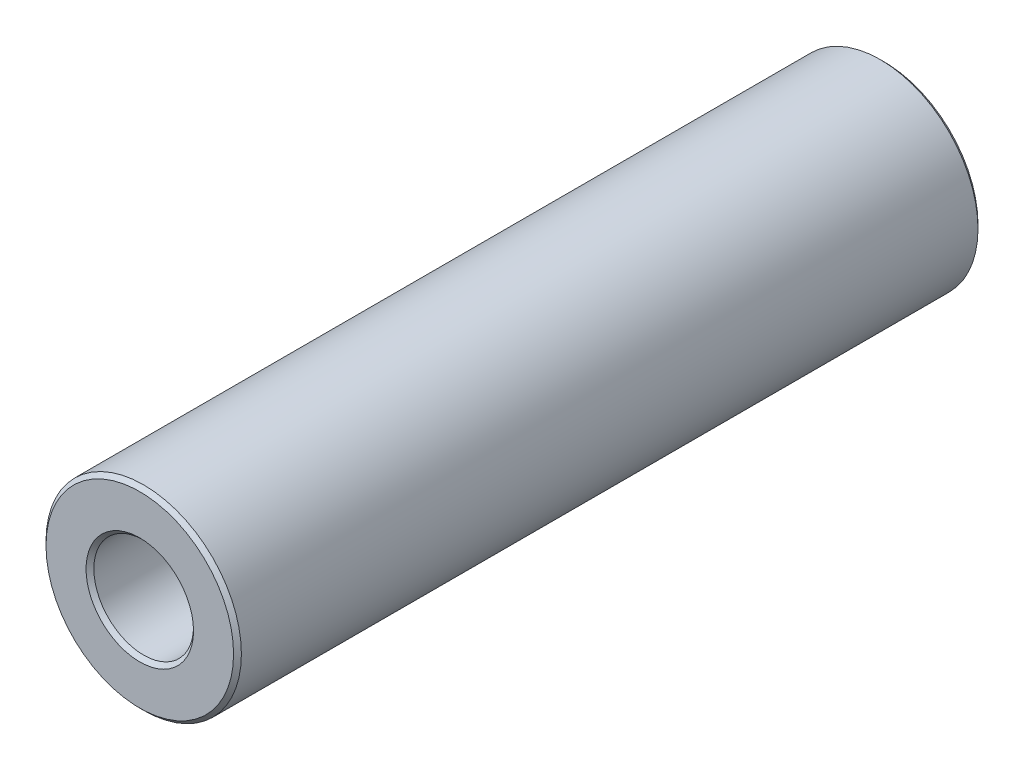
ISO-10303-21;
HEADER;
FILE_DESCRIPTION(('STEP AP214'),'2;1');
FILE_NAME('part.step','',(''),(''),'','','');
FILE_SCHEMA(('AUTOMOTIVE_DESIGN { 1 0 10303 214 1 1 1 1 }'));
ENDSEC;
DATA;
#1=APPLICATION_CONTEXT('core data for automotive mechanical design processes');
#2=APPLICATION_PROTOCOL_DEFINITION('international standard','automotive_design',2000,#1);
#3=PRODUCT_CONTEXT('',#1,'mechanical');
#4=PRODUCT('Part','Part','',(#3));
#5=PRODUCT_RELATED_PRODUCT_CATEGORY('part','',(#4));
#6=PRODUCT_DEFINITION_FORMATION('','',#4);
#7=PRODUCT_DEFINITION_CONTEXT('part definition',#1,'design');
#8=PRODUCT_DEFINITION('design','',#6,#7);
#9=PRODUCT_DEFINITION_SHAPE('','',#8);
#10=(LENGTH_UNIT() NAMED_UNIT(*) SI_UNIT(.MILLI.,.METRE.));
#11=(NAMED_UNIT(*) PLANE_ANGLE_UNIT() SI_UNIT($,.RADIAN.));
#12=(NAMED_UNIT(*) SI_UNIT($,.STERADIAN.) SOLID_ANGLE_UNIT());
#13=UNCERTAINTY_MEASURE_WITH_UNIT(LENGTH_MEASURE(1.E-05),#10,'distance_accuracy_value','');
#14=(GEOMETRIC_REPRESENTATION_CONTEXT(3) GLOBAL_UNCERTAINTY_ASSIGNED_CONTEXT((#13)) GLOBAL_UNIT_ASSIGNED_CONTEXT((#10,
#11,#12)) REPRESENTATION_CONTEXT('',''));
#15=CARTESIAN_POINT('',(0.,0.,0.));
#16=DIRECTION('',(0.,0.,1.));
#17=DIRECTION('',(1.,0.,0.));
#18=AXIS2_PLACEMENT_3D('',#15,#16,#17);
#19=CARTESIAN_POINT('',(0.,0.,38.1));
#20=DIRECTION('',(0.,0.,1.));
#21=DIRECTION('',(1.,0.,0.));
#22=AXIS2_PLACEMENT_3D('',#19,#20,#21);
#23=PLANE('',#22);
#24=CARTESIAN_POINT('',(0.,0.,38.1));
#25=DIRECTION('',(0.,0.,1.));
#26=DIRECTION('',(1.,0.,0.));
#27=AXIS2_PLACEMENT_3D('',#24,#25,#26);
#28=CIRCLE('',#27,2.75000000000003);
#29=CARTESIAN_POINT('',(2.75000000000003,0.,38.1));
#30=VERTEX_POINT('',#29);
#31=EDGE_CURVE('E10',#30,#30,#28,.F.);
#32=ORIENTED_EDGE('',*,*,#31,.T.);
#33=EDGE_LOOP('',(#32));
#34=FACE_BOUND('',#33,.T.);
#35=CARTESIAN_POINT('',(0.,0.,38.1));
#36=DIRECTION('',(0.,0.,1.));
#37=DIRECTION('',(1.,0.,0.));
#38=AXIS2_PLACEMENT_3D('',#35,#36,#37);
#39=CIRCLE('',#38,4.80000000000002);
#40=CARTESIAN_POINT('',(-4.80000000000003,0.,38.1));
#41=VERTEX_POINT('',#40);
#42=EDGE_CURVE('E39',#41,#41,#39,.T.);
#43=ORIENTED_EDGE('',*,*,#42,.T.);
#44=EDGE_LOOP('',(#43));
#45=FACE_BOUND('',#44,.T.);
#46=ADVANCED_FACE('F32',(#34,#45),#23,.T.);
#47=CARTESIAN_POINT('',(0.,0.,0.));
#48=DIRECTION('',(0.,0.,1.));
#49=DIRECTION('',(1.,0.,0.));
#50=AXIS2_PLACEMENT_3D('',#47,#48,#49);
#51=PLANE('',#50);
#52=CARTESIAN_POINT('',(0.,0.,0.));
#53=DIRECTION('',(0.,0.,1.));
#54=DIRECTION('',(1.,0.,0.));
#55=AXIS2_PLACEMENT_3D('',#52,#53,#54);
#56=CIRCLE('',#55,4.79999999999997);
#57=CARTESIAN_POINT('',(4.79999999999997,0.,0.));
#58=VERTEX_POINT('',#57);
#59=EDGE_CURVE('E52',#58,#58,#56,.F.);
#60=ORIENTED_EDGE('',*,*,#59,.T.);
#61=EDGE_LOOP('',(#60));
#62=FACE_BOUND('',#61,.T.);
#63=CARTESIAN_POINT('',(0.,0.,0.));
#64=DIRECTION('',(0.,0.,1.));
#65=DIRECTION('',(1.,0.,0.));
#66=AXIS2_PLACEMENT_3D('',#63,#64,#65);
#67=CIRCLE('',#66,2.74999999999999);
#68=CARTESIAN_POINT('',(2.74999999999999,0.,0.));
#69=VERTEX_POINT('',#68);
#70=EDGE_CURVE('E55',#69,#69,#67,.T.);
#71=ORIENTED_EDGE('',*,*,#70,.T.);
#72=EDGE_LOOP('',(#71));
#73=FACE_BOUND('',#72,.T.);
#74=ADVANCED_FACE('F76',(#62,#73),#51,.F.);
#75=CARTESIAN_POINT('',(0.,0.,38.1));
#76=DIRECTION('',(0.,0.,-1.));
#77=DIRECTION('',(-1.,0.,0.));
#78=AXIS2_PLACEMENT_3D('',#75,#76,#77);
#79=CYLINDRICAL_SURFACE('',#78,5.);
#80=CARTESIAN_POINT('',(0.,0.,0.200000000000033));
#81=DIRECTION('',(0.,0.,1.));
#82=DIRECTION('',(1.,0.,0.));
#83=AXIS2_PLACEMENT_3D('',#80,#81,#82);
#84=CIRCLE('',#83,5.);
#85=CARTESIAN_POINT('',(-5.,0.,0.200000000000033));
#86=VERTEX_POINT('',#85);
#87=EDGE_CURVE('E58',#86,#86,#84,.T.);
#88=CARTESIAN_POINT('',(0.,0.,37.9));
#89=DIRECTION('',(0.,0.,1.));
#90=DIRECTION('',(1.,0.,0.));
#91=AXIS2_PLACEMENT_3D('',#88,#89,#90);
#92=CIRCLE('',#91,5.);
#93=CARTESIAN_POINT('',(-5.,0.,37.9));
#94=VERTEX_POINT('',#93);
#95=EDGE_CURVE('E61',#94,#94,#92,.F.);
#96=CARTESIAN_POINT('',(-5.,0.,0.200000000000033));
#97=CARTESIAN_POINT('',(-5.,0.,0.592708333333367));
#98=CARTESIAN_POINT('',(-5.,0.,0.985416666666701));
#99=CARTESIAN_POINT('',(-5.,0.,1.77083333333337));
#100=CARTESIAN_POINT('',(-5.,0.,2.1635416666667));
#101=CARTESIAN_POINT('',(-5.,0.,2.94895833333336));
#102=CARTESIAN_POINT('',(-5.,0.,3.3416666666667));
#103=CARTESIAN_POINT('',(-5.,0.,4.12708333333337));
#104=CARTESIAN_POINT('',(-5.,0.,4.5197916666667));
#105=CARTESIAN_POINT('',(-5.,0.,5.30520833333337));
#106=CARTESIAN_POINT('',(-5.,0.,5.6979166666667));
#107=CARTESIAN_POINT('',(-5.,0.,6.48333333333336));
#108=CARTESIAN_POINT('',(-5.,0.,6.8760416666667));
#109=CARTESIAN_POINT('',(-5.,0.,7.66145833333336));
#110=CARTESIAN_POINT('',(-5.,0.,8.0541666666667));
#111=CARTESIAN_POINT('',(-5.,0.,8.83958333333336));
#112=CARTESIAN_POINT('',(-5.,0.,9.2322916666667));
#113=CARTESIAN_POINT('',(-5.,0.,10.0177083333334));
#114=CARTESIAN_POINT('',(-5.,0.,10.4104166666667));
#115=CARTESIAN_POINT('',(-5.,0.,11.1958333333334));
#116=CARTESIAN_POINT('',(-5.,0.,11.5885416666667));
#117=CARTESIAN_POINT('',(-5.,0.,12.3739583333334));
#118=CARTESIAN_POINT('',(-5.,0.,12.7666666666667));
#119=CARTESIAN_POINT('',(-5.,0.,13.5520833333334));
#120=CARTESIAN_POINT('',(-5.,0.,13.9447916666667));
#121=CARTESIAN_POINT('',(-5.,0.,14.7302083333334));
#122=CARTESIAN_POINT('',(-5.,0.,15.1229166666667));
#123=CARTESIAN_POINT('',(-5.,0.,15.9083333333334));
#124=CARTESIAN_POINT('',(-5.,0.,16.3010416666667));
#125=CARTESIAN_POINT('',(-5.,0.,17.0864583333334));
#126=CARTESIAN_POINT('',(-5.,0.,17.4791666666667));
#127=CARTESIAN_POINT('',(-5.,0.,18.2645833333334));
#128=CARTESIAN_POINT('',(-5.,0.,18.6572916666667));
#129=CARTESIAN_POINT('',(-5.,0.,19.4427083333334));
#130=CARTESIAN_POINT('',(-5.,0.,19.8354166666667));
#131=CARTESIAN_POINT('',(-5.,0.,20.6208333333334));
#132=CARTESIAN_POINT('',(-5.,0.,21.0135416666667));
#133=CARTESIAN_POINT('',(-5.,0.,21.7989583333334));
#134=CARTESIAN_POINT('',(-5.,0.,22.1916666666667));
#135=CARTESIAN_POINT('',(-5.,0.,22.9770833333334));
#136=CARTESIAN_POINT('',(-5.,0.,23.3697916666667));
#137=CARTESIAN_POINT('',(-5.,0.,24.1552083333334));
#138=CARTESIAN_POINT('',(-5.,0.,24.5479166666667));
#139=CARTESIAN_POINT('',(-5.,0.,25.3333333333334));
#140=CARTESIAN_POINT('',(-5.,0.,25.7260416666667));
#141=CARTESIAN_POINT('',(-5.,0.,26.5114583333334));
#142=CARTESIAN_POINT('',(-5.,0.,26.9041666666667));
#143=CARTESIAN_POINT('',(-5.,0.,27.6895833333334));
#144=CARTESIAN_POINT('',(-5.,0.,28.0822916666667));
#145=CARTESIAN_POINT('',(-5.,0.,28.8677083333334));
#146=CARTESIAN_POINT('',(-5.,0.,29.2604166666667));
#147=CARTESIAN_POINT('',(-5.,0.,30.0458333333334));
#148=CARTESIAN_POINT('',(-5.,0.,30.4385416666667));
#149=CARTESIAN_POINT('',(-5.,0.,31.2239583333334));
#150=CARTESIAN_POINT('',(-5.,0.,31.6166666666667));
#151=CARTESIAN_POINT('',(-5.,0.,32.4020833333334));
#152=CARTESIAN_POINT('',(-5.,0.,32.7947916666667));
#153=CARTESIAN_POINT('',(-5.,0.,33.5802083333334));
#154=CARTESIAN_POINT('',(-5.,0.,33.9729166666667));
#155=CARTESIAN_POINT('',(-5.,0.,34.7583333333334));
#156=CARTESIAN_POINT('',(-5.,0.,35.1510416666667));
#157=CARTESIAN_POINT('',(-5.,0.,35.9364583333334));
#158=CARTESIAN_POINT('',(-5.,0.,36.3291666666667));
#159=CARTESIAN_POINT('',(-5.,0.,37.1145833333334));
#160=CARTESIAN_POINT('',(-5.,0.,37.5072916666667));
#161=CARTESIAN_POINT('',(-5.,0.,37.9));
#162=B_SPLINE_CURVE_WITH_KNOTS('',3,(#96,#97,#98,#99,#100,#101,#102,#103,#104,#105,#106,#107,
#108,#109,#110,#111,#112,#113,#114,#115,#116,#117,#118,#119,#120,#121,#122,#123,#124,#125,#126,
#127,#128,#129,#130,#131,#132,#133,#134,#135,#136,#137,#138,#139,#140,#141,#142,#143,#144,#145,
#146,#147,#148,#149,#150,#151,#152,#153,#154,#155,#156,#157,#158,#159,#160,#161),.UNSPECIFIED.,
.F.,.F.,(4,2,2,2,2,2,2,2,2,2,2,2,2,2,2,2,2,2,2,2,2,2,2,2,2,2,2,2,2,2,2,2,4),(0.,1.178125,
2.35625,3.534375,4.7125,5.890625,7.06875,8.246875,9.425,10.603125,11.78125,12.959375,14.1375,
15.315625,16.49375,17.671875,18.85,20.028125,21.20625,22.384375,23.5625,24.740625,25.91875,
27.096875,28.275,29.453125,30.63125,31.809375,32.9875,34.165625,35.34375,36.521875,37.7),.UNSPECIFIED.);
#163=EDGE_CURVE('BSEAM65',#86,#94,#162,.T.);
#164=ORIENTED_EDGE('',*,*,#87,.T.);
#165=ORIENTED_EDGE('',*,*,#95,.T.);
#166=ORIENTED_EDGE('',*,*,#163,.T.);
#167=ORIENTED_EDGE('',*,*,#163,.F.);
#168=EDGE_LOOP('',(#164,#166,#165,#167));
#169=FACE_BOUND('',#168,.T.);
#170=ADVANCED_FACE('F65',(#169),#79,.T.);
#171=CARTESIAN_POINT('',(0.,0.,38.1));
#172=DIRECTION('',(0.,0.,-1.));
#173=DIRECTION('',(-1.,0.,0.));
#174=AXIS2_PLACEMENT_3D('',#171,#172,#173);
#175=CYLINDRICAL_SURFACE('',#174,2.55);
#176=CARTESIAN_POINT('',(0.,0.,0.199999999999992));
#177=DIRECTION('',(0.,0.,1.));
#178=DIRECTION('',(1.,0.,0.));
#179=AXIS2_PLACEMENT_3D('',#176,#177,#178);
#180=CIRCLE('',#179,2.55);
#181=CARTESIAN_POINT('',(-2.55,0.,0.199999999999992));
#182=VERTEX_POINT('',#181);
#183=EDGE_CURVE('E43',#182,#182,#180,.F.);
#184=CARTESIAN_POINT('',(0.,0.,37.9));
#185=DIRECTION('',(0.,0.,1.));
#186=DIRECTION('',(1.,0.,0.));
#187=AXIS2_PLACEMENT_3D('',#184,#185,#186);
#188=CIRCLE('',#187,2.55);
#189=CARTESIAN_POINT('',(-2.55,0.,37.9));
#190=VERTEX_POINT('',#189);
#191=EDGE_CURVE('E47',#190,#190,#188,.T.);
#192=CARTESIAN_POINT('',(-2.55,0.,0.199999999999992));
#193=CARTESIAN_POINT('',(-2.55,0.,0.592708333333325));
#194=CARTESIAN_POINT('',(-2.55,0.,0.98541666666666));
#195=CARTESIAN_POINT('',(-2.55,0.,1.77083333333333));
#196=CARTESIAN_POINT('',(-2.55,0.,2.16354166666666));
#197=CARTESIAN_POINT('',(-2.55,0.,2.94895833333332));
#198=CARTESIAN_POINT('',(-2.55,0.,3.34166666666666));
#199=CARTESIAN_POINT('',(-2.55,0.,4.12708333333333));
#200=CARTESIAN_POINT('',(-2.55,0.,4.51979166666666));
#201=CARTESIAN_POINT('',(-2.55,0.,5.30520833333332));
#202=CARTESIAN_POINT('',(-2.55,0.,5.69791666666666));
#203=CARTESIAN_POINT('',(-2.55,0.,6.48333333333332));
#204=CARTESIAN_POINT('',(-2.55,0.,6.87604166666665));
#205=CARTESIAN_POINT('',(-2.55,0.,7.66145833333332));
#206=CARTESIAN_POINT('',(-2.55,0.,8.05416666666666));
#207=CARTESIAN_POINT('',(-2.55,0.,8.83958333333332));
#208=CARTESIAN_POINT('',(-2.55,0.,9.23229166666665));
#209=CARTESIAN_POINT('',(-2.55,0.,10.0177083333333));
#210=CARTESIAN_POINT('',(-2.55,0.,10.4104166666667));
#211=CARTESIAN_POINT('',(-2.55,0.,11.1958333333333));
#212=CARTESIAN_POINT('',(-2.55,0.,11.5885416666667));
#213=CARTESIAN_POINT('',(-2.55,0.,12.3739583333333));
#214=CARTESIAN_POINT('',(-2.55,0.,12.7666666666667));
#215=CARTESIAN_POINT('',(-2.55,0.,13.5520833333333));
#216=CARTESIAN_POINT('',(-2.55,0.,13.9447916666667));
#217=CARTESIAN_POINT('',(-2.55,0.,14.7302083333333));
#218=CARTESIAN_POINT('',(-2.55,0.,15.1229166666667));
#219=CARTESIAN_POINT('',(-2.55,0.,15.9083333333333));
#220=CARTESIAN_POINT('',(-2.55,0.,16.3010416666667));
#221=CARTESIAN_POINT('',(-2.55,0.,17.0864583333333));
#222=CARTESIAN_POINT('',(-2.55,0.,17.4791666666667));
#223=CARTESIAN_POINT('',(-2.55,0.,18.2645833333333));
#224=CARTESIAN_POINT('',(-2.55,0.,18.6572916666667));
#225=CARTESIAN_POINT('',(-2.55,0.,19.4427083333333));
#226=CARTESIAN_POINT('',(-2.55,0.,19.8354166666667));
#227=CARTESIAN_POINT('',(-2.55,0.,20.6208333333333));
#228=CARTESIAN_POINT('',(-2.55,0.,21.0135416666667));
#229=CARTESIAN_POINT('',(-2.55,0.,21.7989583333333));
#230=CARTESIAN_POINT('',(-2.55,0.,22.1916666666667));
#231=CARTESIAN_POINT('',(-2.55,0.,22.9770833333333));
#232=CARTESIAN_POINT('',(-2.55,0.,23.3697916666667));
#233=CARTESIAN_POINT('',(-2.55,0.,24.1552083333333));
#234=CARTESIAN_POINT('',(-2.55,0.,24.5479166666667));
#235=CARTESIAN_POINT('',(-2.55,0.,25.3333333333333));
#236=CARTESIAN_POINT('',(-2.55,0.,25.7260416666666));
#237=CARTESIAN_POINT('',(-2.55,0.,26.5114583333333));
#238=CARTESIAN_POINT('',(-2.55,0.,26.9041666666667));
#239=CARTESIAN_POINT('',(-2.55,0.,27.6895833333333));
#240=CARTESIAN_POINT('',(-2.55,0.,28.0822916666667));
#241=CARTESIAN_POINT('',(-2.55,0.,28.8677083333333));
#242=CARTESIAN_POINT('',(-2.55,0.,29.2604166666667));
#243=CARTESIAN_POINT('',(-2.55,0.,30.0458333333333));
#244=CARTESIAN_POINT('',(-2.55,0.,30.4385416666666));
#245=CARTESIAN_POINT('',(-2.55,0.,31.2239583333333));
#246=CARTESIAN_POINT('',(-2.55,0.,31.6166666666667));
#247=CARTESIAN_POINT('',(-2.55,0.,32.4020833333333));
#248=CARTESIAN_POINT('',(-2.55,0.,32.7947916666666));
#249=CARTESIAN_POINT('',(-2.55,0.,33.5802083333333));
#250=CARTESIAN_POINT('',(-2.55,0.,33.9729166666666));
#251=CARTESIAN_POINT('',(-2.55,0.,34.7583333333333));
#252=CARTESIAN_POINT('',(-2.55,0.,35.1510416666667));
#253=CARTESIAN_POINT('',(-2.55,0.,35.9364583333333));
#254=CARTESIAN_POINT('',(-2.55,0.,36.3291666666667));
#255=CARTESIAN_POINT('',(-2.55,0.,37.1145833333333));
#256=CARTESIAN_POINT('',(-2.55,0.,37.5072916666667));
#257=CARTESIAN_POINT('',(-2.55,0.,37.9));
#258=B_SPLINE_CURVE_WITH_KNOTS('',3,(#192,#193,#194,#195,#196,#197,#198,#199,#200,#201,#202,
#203,#204,#205,#206,#207,#208,#209,#210,#211,#212,#213,#214,#215,#216,#217,#218,#219,#220,#221,
#222,#223,#224,#225,#226,#227,#228,#229,#230,#231,#232,#233,#234,#235,#236,#237,#238,#239,#240,
#241,#242,#243,#244,#245,#246,#247,#248,#249,#250,#251,#252,#253,#254,#255,#256,#257),
.UNSPECIFIED.,.F.,.F.,(4,2,2,2,2,2,2,2,2,2,2,2,2,2,2,2,2,2,2,2,2,2,2,2,2,2,2,2,2,2,2,2,4),(0.,
1.178125,2.35625,3.534375,4.7125,5.890625,7.06875,8.246875,9.425,10.603125,11.78125,12.959375,
14.1375,15.315625,16.49375,17.671875,18.85,20.028125,21.20625,22.384375,23.5625,24.740625,
25.91875,27.096875,28.275,29.453125,30.63125,31.809375,32.9875,34.165625,35.34375,36.521875,
37.7),.UNSPECIFIED.);
#259=EDGE_CURVE('BSEAM84',#182,#190,#258,.T.);
#260=ORIENTED_EDGE('',*,*,#183,.T.);
#261=ORIENTED_EDGE('',*,*,#191,.T.);
#262=ORIENTED_EDGE('',*,*,#259,.T.);
#263=ORIENTED_EDGE('',*,*,#259,.F.);
#264=EDGE_LOOP('',(#260,#262,#261,#263));
#265=FACE_BOUND('',#264,.T.);
#266=ADVANCED_FACE('F84',(#265),#175,.F.);
#267=CARTESIAN_POINT('',(0.,0.,0.200000000000027));
#268=DIRECTION('',(0.,0.,1.));
#269=DIRECTION('',(1.,0.,0.));
#270=AXIS2_PLACEMENT_3D('',#267,#268,#269);
#271=CONICAL_SURFACE('',#270,5.,0.785398163397448);
#272=ORIENTED_EDGE('',*,*,#59,.F.);
#273=EDGE_LOOP('',(#272));
#274=FACE_BOUND('',#273,.T.);
#275=ORIENTED_EDGE('',*,*,#87,.F.);
#276=EDGE_LOOP('',(#275));
#277=FACE_BOUND('',#276,.T.);
#278=ADVANCED_FACE('F89',(#274,#277),#271,.T.);
#279=CARTESIAN_POINT('',(0.,0.,0.));
#280=DIRECTION('',(0.,0.,-1.));
#281=DIRECTION('',(-1.,0.,0.));
#282=AXIS2_PLACEMENT_3D('',#279,#280,#281);
#283=CONICAL_SURFACE('',#282,2.74999999999999,0.785398163397448);
#284=ORIENTED_EDGE('',*,*,#183,.F.);
#285=EDGE_LOOP('',(#284));
#286=FACE_BOUND('',#285,.T.);
#287=ORIENTED_EDGE('',*,*,#70,.F.);
#288=EDGE_LOOP('',(#287));
#289=FACE_BOUND('',#288,.T.);
#290=ADVANCED_FACE('F73',(#286,#289),#283,.F.);
#291=CARTESIAN_POINT('',(0.,0.,37.9));
#292=DIRECTION('',(0.,0.,1.));
#293=DIRECTION('',(1.,0.,0.));
#294=AXIS2_PLACEMENT_3D('',#291,#292,#293);
#295=CONICAL_SURFACE('',#294,2.55,0.785398163397466);
#296=ORIENTED_EDGE('',*,*,#31,.F.);
#297=EDGE_LOOP('',(#296));
#298=FACE_BOUND('',#297,.T.);
#299=ORIENTED_EDGE('',*,*,#191,.F.);
#300=EDGE_LOOP('',(#299));
#301=FACE_BOUND('',#300,.T.);
#302=ADVANCED_FACE('F69',(#298,#301),#295,.F.);
#303=CARTESIAN_POINT('',(0.,0.,38.1));
#304=DIRECTION('',(0.,0.,-1.));
#305=DIRECTION('',(-1.,0.,0.));
#306=AXIS2_PLACEMENT_3D('',#303,#304,#305);
#307=CONICAL_SURFACE('',#306,4.80000000000002,0.785398163397448);
#308=CARTESIAN_POINT('',(-5.,0.,37.9));
#309=CARTESIAN_POINT('',(-4.99791666666667,0.,37.9020833333334));
#310=CARTESIAN_POINT('',(-4.99583333333334,0.,37.9041666666667));
#311=CARTESIAN_POINT('',(-4.99166666666667,0.,37.9083333333334));
#312=CARTESIAN_POINT('',(-4.98958333333334,0.,37.9104166666667));
#313=CARTESIAN_POINT('',(-4.98541666666667,0.,37.9145833333334));
#314=CARTESIAN_POINT('',(-4.98333333333334,0.,37.9166666666667));
#315=CARTESIAN_POINT('',(-4.97916666666667,0.,37.9208333333334));
#316=CARTESIAN_POINT('',(-4.97708333333334,0.,37.9229166666667));
#317=CARTESIAN_POINT('',(-4.97291666666667,0.,37.9270833333334));
#318=CARTESIAN_POINT('',(-4.97083333333334,0.,37.9291666666667));
#319=CARTESIAN_POINT('',(-4.96666666666667,0.,37.9333333333334));
#320=CARTESIAN_POINT('',(-4.96458333333334,0.,37.9354166666667));
#321=CARTESIAN_POINT('',(-4.96041666666667,0.,37.9395833333334));
#322=CARTESIAN_POINT('',(-4.95833333333334,0.,37.9416666666667));
#323=CARTESIAN_POINT('',(-4.95416666666668,0.,37.9458333333334));
#324=CARTESIAN_POINT('',(-4.95208333333334,0.,37.9479166666667));
#325=CARTESIAN_POINT('',(-4.94791666666668,0.,37.9520833333333));
#326=CARTESIAN_POINT('',(-4.94583333333334,0.,37.9541666666667));
#327=CARTESIAN_POINT('',(-4.94166666666668,0.,37.9583333333333));
#328=CARTESIAN_POINT('',(-4.93958333333334,0.,37.9604166666667));
#329=CARTESIAN_POINT('',(-4.93541666666668,0.,37.9645833333334));
#330=CARTESIAN_POINT('',(-4.93333333333334,0.,37.9666666666667));
#331=CARTESIAN_POINT('',(-4.92916666666668,0.,37.9708333333334));
#332=CARTESIAN_POINT('',(-4.92708333333334,0.,37.9729166666667));
#333=CARTESIAN_POINT('',(-4.92291666666668,0.,37.9770833333333));
#334=CARTESIAN_POINT('',(-4.92083333333335,0.,37.9791666666667));
#335=CARTESIAN_POINT('',(-4.91666666666668,0.,37.9833333333333));
#336=CARTESIAN_POINT('',(-4.91458333333335,0.,37.9854166666667));
#337=CARTESIAN_POINT('',(-4.91041666666668,0.,37.9895833333333));
#338=CARTESIAN_POINT('',(-4.90833333333335,0.,37.9916666666667));
#339=CARTESIAN_POINT('',(-4.90416666666668,0.,37.9958333333333));
#340=CARTESIAN_POINT('',(-4.90208333333335,0.,37.9979166666667));
#341=CARTESIAN_POINT('',(-4.89791666666668,0.,38.0020833333333));
#342=CARTESIAN_POINT('',(-4.89583333333335,0.,38.0041666666667));
#343=CARTESIAN_POINT('',(-4.89166666666668,0.,38.0083333333333));
#344=CARTESIAN_POINT('',(-4.88958333333335,0.,38.0104166666667));
#345=CARTESIAN_POINT('',(-4.88541666666668,0.,38.0145833333333));
#346=CARTESIAN_POINT('',(-4.88333333333335,0.,38.0166666666667));
#347=CARTESIAN_POINT('',(-4.87916666666668,0.,38.0208333333333));
#348=CARTESIAN_POINT('',(-4.87708333333335,0.,38.0229166666667));
#349=CARTESIAN_POINT('',(-4.87291666666668,0.,38.0270833333333));
#350=CARTESIAN_POINT('',(-4.87083333333335,0.,38.0291666666667));
#351=CARTESIAN_POINT('',(-4.86666666666668,0.,38.0333333333333));
#352=CARTESIAN_POINT('',(-4.86458333333335,0.,38.0354166666667));
#353=CARTESIAN_POINT('',(-4.86041666666669,0.,38.0395833333333));
#354=CARTESIAN_POINT('',(-4.85833333333335,0.,38.0416666666667));
#355=CARTESIAN_POINT('',(-4.85416666666669,0.,38.0458333333333));
#356=CARTESIAN_POINT('',(-4.85208333333335,0.,38.0479166666667));
#357=CARTESIAN_POINT('',(-4.84791666666669,0.,38.0520833333333));
#358=CARTESIAN_POINT('',(-4.84583333333335,0.,38.0541666666667));
#359=CARTESIAN_POINT('',(-4.84166666666669,0.,38.0583333333333));
#360=CARTESIAN_POINT('',(-4.83958333333335,0.,38.0604166666667));
#361=CARTESIAN_POINT('',(-4.83541666666669,0.,38.0645833333333));
#362=CARTESIAN_POINT('',(-4.83333333333336,0.,38.0666666666667));
#363=CARTESIAN_POINT('',(-4.82916666666669,0.,38.0708333333333));
#364=CARTESIAN_POINT('',(-4.82708333333336,0.,38.0729166666667));
#365=CARTESIAN_POINT('',(-4.82291666666669,0.,38.0770833333333));
#366=CARTESIAN_POINT('',(-4.82083333333336,0.,38.0791666666667));
#367=CARTESIAN_POINT('',(-4.81666666666669,0.,38.0833333333333));
#368=CARTESIAN_POINT('',(-4.81458333333336,0.,38.0854166666667));
#369=CARTESIAN_POINT('',(-4.81041666666669,0.,38.0895833333333));
#370=CARTESIAN_POINT('',(-4.80833333333336,0.,38.0916666666667));
#371=CARTESIAN_POINT('',(-4.80416666666669,0.,38.0958333333333));
#372=CARTESIAN_POINT('',(-4.80208333333336,0.,38.0979166666667));
#373=CARTESIAN_POINT('',(-4.80000000000003,0.,38.1));
#374=B_SPLINE_CURVE_WITH_KNOTS('',3,(#308,#309,#310,#311,#312,#313,#314,#315,#316,#317,#318,
#319,#320,#321,#322,#323,#324,#325,#326,#327,#328,#329,#330,#331,#332,#333,#334,#335,#336,#337,
#338,#339,#340,#341,#342,#343,#344,#345,#346,#347,#348,#349,#350,#351,#352,#353,#354,#355,#356,
#357,#358,#359,#360,#361,#362,#363,#364,#365,#366,#367,#368,#369,#370,#371,#372,#373),
.UNSPECIFIED.,.F.,.F.,(4,2,2,2,2,2,2,2,2,2,2,2,2,2,2,2,2,2,2,2,2,2,2,2,2,2,2,2,2,2,2,2,4),(0.,
0.00883883476483087,0.0176776695296617,0.0265165042944926,0.0353553390593235,0.0441941738241543,
0.0530330085889852,0.0618718433538161,0.070710678118647,0.0795495128834778,0.0883883476483087,
0.0972271824131395,0.10606601717797,0.114904851942801,0.123743686707632,0.132582521472463,
0.141421356237294,0.150260191002125,0.159099025766956,0.167937860531787,0.176776695296617,
0.185615530061448,0.194454364826279,0.20329319959111,0.212132034355941,0.220970869120772,
0.229809703885603,0.238648538650434,0.247487373415264,0.256326208180095,0.265165042944926,
0.274003877709757,0.282842712474588),.UNSPECIFIED.);
#375=EDGE_CURVE('BSEAM34',#94,#41,#374,.T.);
#376=ORIENTED_EDGE('',*,*,#95,.F.);
#377=ORIENTED_EDGE('',*,*,#42,.F.);
#378=ORIENTED_EDGE('',*,*,#375,.T.);
#379=ORIENTED_EDGE('',*,*,#375,.F.);
#380=EDGE_LOOP('',(#376,#378,#377,#379));
#381=FACE_BOUND('',#380,.T.);
#382=ADVANCED_FACE('F34',(#381),#307,.T.);
#383=CLOSED_SHELL('',(#46,#74,#170,#266,#278,#290,#302,#382));
#384=MANIFOLD_SOLID_BREP('B2',#383);
#385=ADVANCED_BREP_SHAPE_REPRESENTATION('',(#18,#384),#14);
#386=SHAPE_DEFINITION_REPRESENTATION(#9,#385);
ENDSEC;
END-ISO-10303-21;
